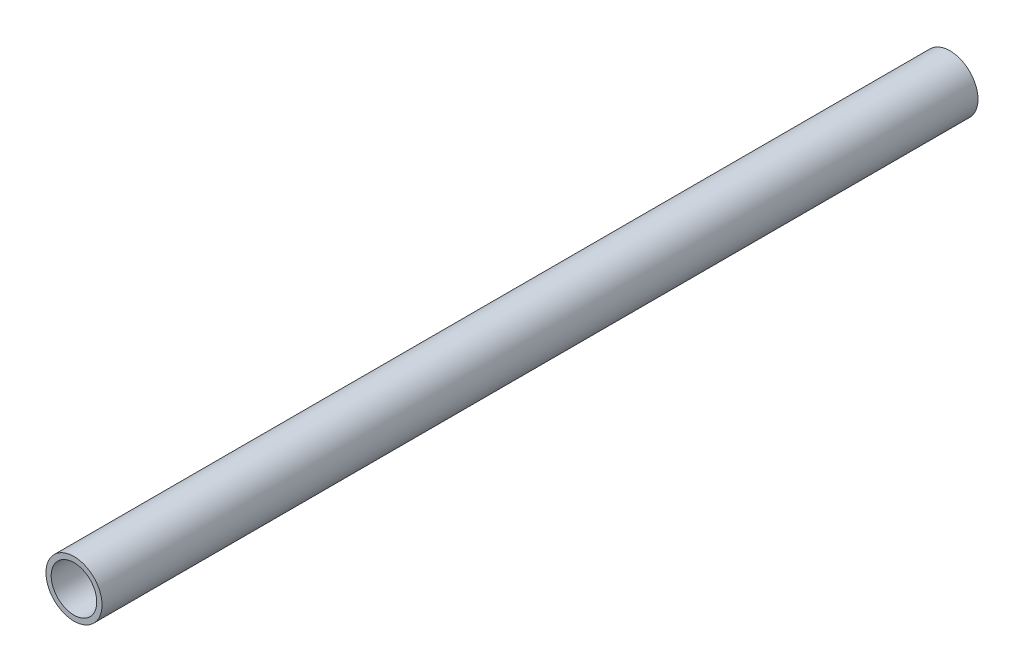
ISO-10303-21;
HEADER;
FILE_DESCRIPTION(('STEP AP214'),'2;1');
FILE_NAME('part.step','',(''),(''),'','','');
FILE_SCHEMA(('AUTOMOTIVE_DESIGN { 1 0 10303 214 1 1 1 1 }'));
ENDSEC;
DATA;
#1=APPLICATION_CONTEXT('core data for automotive mechanical design processes');
#2=APPLICATION_PROTOCOL_DEFINITION('international standard','automotive_design',2000,#1);
#3=PRODUCT_CONTEXT('',#1,'mechanical');
#4=PRODUCT('Part','Part','',(#3));
#5=PRODUCT_RELATED_PRODUCT_CATEGORY('part','',(#4));
#6=PRODUCT_DEFINITION_FORMATION('','',#4);
#7=PRODUCT_DEFINITION_CONTEXT('part definition',#1,'design');
#8=PRODUCT_DEFINITION('design','',#6,#7);
#9=PRODUCT_DEFINITION_SHAPE('','',#8);
#10=(LENGTH_UNIT() NAMED_UNIT(*) SI_UNIT(.MILLI.,.METRE.));
#11=(NAMED_UNIT(*) PLANE_ANGLE_UNIT() SI_UNIT($,.RADIAN.));
#12=(NAMED_UNIT(*) SI_UNIT($,.STERADIAN.) SOLID_ANGLE_UNIT());
#13=UNCERTAINTY_MEASURE_WITH_UNIT(LENGTH_MEASURE(1.E-05),#10,'distance_accuracy_value','');
#14=(GEOMETRIC_REPRESENTATION_CONTEXT(3) GLOBAL_UNCERTAINTY_ASSIGNED_CONTEXT((#13)) GLOBAL_UNIT_ASSIGNED_CONTEXT((#10,
#11,#12)) REPRESENTATION_CONTEXT('',''));
#15=CARTESIAN_POINT('',(0.,0.,0.));
#16=DIRECTION('',(0.,0.,1.));
#17=DIRECTION('',(1.,0.,0.));
#18=AXIS2_PLACEMENT_3D('',#15,#16,#17);
#19=CARTESIAN_POINT('',(0.,0.,250.));
#20=DIRECTION('',(0.,0.,-1.));
#21=DIRECTION('',(-1.,0.,0.));
#22=AXIS2_PLACEMENT_3D('',#19,#20,#21);
#23=CYLINDRICAL_SURFACE('',#22,16.);
#24=CARTESIAN_POINT('',(0.,0.,250.));
#25=DIRECTION('',(0.,0.,1.));
#26=DIRECTION('',(1.,0.,0.));
#27=AXIS2_PLACEMENT_3D('',#24,#25,#26);
#28=CIRCLE('',#27,16.);
#29=CARTESIAN_POINT('',(16.,0.,250.));
#30=VERTEX_POINT('',#29);
#31=EDGE_CURVE('E10',#30,#30,#28,.T.);
#32=ORIENTED_EDGE('',*,*,#31,.F.);
#33=EDGE_LOOP('',(#32));
#34=FACE_BOUND('',#33,.T.);
#35=CARTESIAN_POINT('',(0.,0.,-250.));
#36=DIRECTION('',(0.,0.,1.));
#37=DIRECTION('',(1.,0.,0.));
#38=AXIS2_PLACEMENT_3D('',#35,#36,#37);
#39=CIRCLE('',#38,16.);
#40=CARTESIAN_POINT('',(16.,0.,-250.));
#41=VERTEX_POINT('',#40);
#42=EDGE_CURVE('E33',#41,#41,#39,.T.);
#43=ORIENTED_EDGE('',*,*,#42,.T.);
#44=EDGE_LOOP('',(#43));
#45=FACE_BOUND('',#44,.T.);
#46=ADVANCED_FACE('F30',(#34,#45),#23,.T.);
#47=CARTESIAN_POINT('',(0.,0.,250.));
#48=DIRECTION('',(0.,0.,1.));
#49=DIRECTION('',(1.,0.,0.));
#50=AXIS2_PLACEMENT_3D('',#47,#48,#49);
#51=PLANE('',#50);
#52=CARTESIAN_POINT('',(0.,0.,250.));
#53=DIRECTION('',(0.,0.,1.));
#54=DIRECTION('',(1.,0.,0.));
#55=AXIS2_PLACEMENT_3D('',#52,#53,#54);
#56=CIRCLE('',#55,13.);
#57=CARTESIAN_POINT('',(13.,0.,250.));
#58=VERTEX_POINT('',#57);
#59=EDGE_CURVE('E40',#58,#58,#56,.T.);
#60=ORIENTED_EDGE('',*,*,#59,.F.);
#61=EDGE_LOOP('',(#60));
#62=FACE_BOUND('',#61,.T.);
#63=ORIENTED_EDGE('',*,*,#31,.T.);
#64=EDGE_LOOP('',(#63));
#65=FACE_BOUND('',#64,.T.);
#66=ADVANCED_FACE('F51',(#62,#65),#51,.T.);
#67=CARTESIAN_POINT('',(0.,0.,-250.));
#68=DIRECTION('',(0.,0.,1.));
#69=DIRECTION('',(1.,0.,0.));
#70=AXIS2_PLACEMENT_3D('',#67,#68,#69);
#71=PLANE('',#70);
#72=CARTESIAN_POINT('',(0.,0.,-250.));
#73=DIRECTION('',(0.,0.,1.));
#74=DIRECTION('',(1.,0.,0.));
#75=AXIS2_PLACEMENT_3D('',#72,#73,#74);
#76=CIRCLE('',#75,13.);
#77=CARTESIAN_POINT('',(13.,0.,-250.));
#78=VERTEX_POINT('',#77);
#79=EDGE_CURVE('E42',#78,#78,#76,.T.);
#80=ORIENTED_EDGE('',*,*,#79,.T.);
#81=EDGE_LOOP('',(#80));
#82=FACE_BOUND('',#81,.T.);
#83=ORIENTED_EDGE('',*,*,#42,.F.);
#84=EDGE_LOOP('',(#83));
#85=FACE_BOUND('',#84,.T.);
#86=ADVANCED_FACE('F53',(#82,#85),#71,.F.);
#87=CARTESIAN_POINT('',(0.,0.,250.));
#88=DIRECTION('',(0.,0.,-1.));
#89=DIRECTION('',(-1.,0.,0.));
#90=AXIS2_PLACEMENT_3D('',#87,#88,#89);
#91=CYLINDRICAL_SURFACE('',#90,13.);
#92=ORIENTED_EDGE('',*,*,#59,.T.);
#93=EDGE_LOOP('',(#92));
#94=FACE_BOUND('',#93,.T.);
#95=ORIENTED_EDGE('',*,*,#79,.F.);
#96=EDGE_LOOP('',(#95));
#97=FACE_BOUND('',#96,.T.);
#98=ADVANCED_FACE('F48',(#94,#97),#91,.F.);
#99=CLOSED_SHELL('',(#46,#66,#86,#98));
#100=MANIFOLD_SOLID_BREP('B2',#99);
#101=ADVANCED_BREP_SHAPE_REPRESENTATION('',(#18,#100),#14);
#102=SHAPE_DEFINITION_REPRESENTATION(#9,#101);
ENDSEC;
END-ISO-10303-21;
